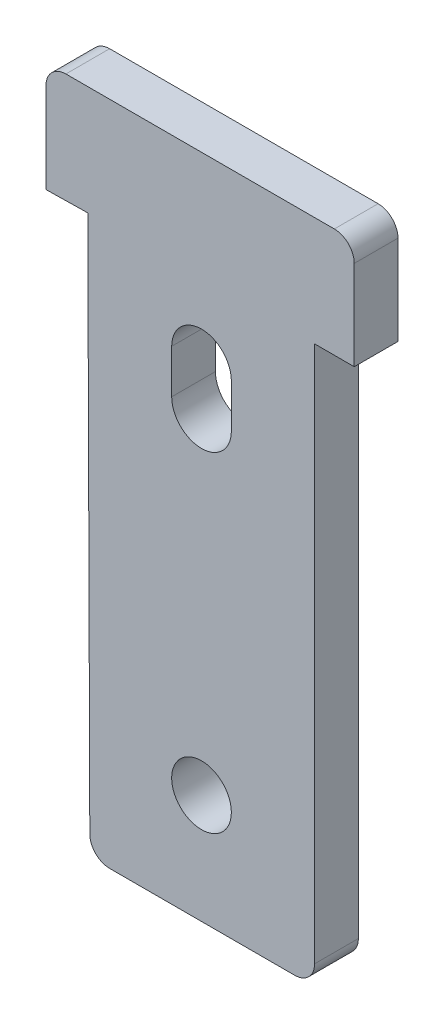
ISO-10303-21;
HEADER;
FILE_DESCRIPTION(('STEP AP214'),'2;1');
FILE_NAME('part.step','',(''),(''),'','','');
FILE_SCHEMA(('AUTOMOTIVE_DESIGN { 1 0 10303 214 1 1 1 1 }'));
ENDSEC;
DATA;
#1=APPLICATION_CONTEXT('core data for automotive mechanical design processes');
#2=APPLICATION_PROTOCOL_DEFINITION('international standard','automotive_design',2000,#1);
#3=PRODUCT_CONTEXT('',#1,'mechanical');
#4=PRODUCT('Part','Part','',(#3));
#5=PRODUCT_RELATED_PRODUCT_CATEGORY('part','',(#4));
#6=PRODUCT_DEFINITION_FORMATION('','',#4);
#7=PRODUCT_DEFINITION_CONTEXT('part definition',#1,'design');
#8=PRODUCT_DEFINITION('design','',#6,#7);
#9=PRODUCT_DEFINITION_SHAPE('','',#8);
#10=(LENGTH_UNIT() NAMED_UNIT(*) SI_UNIT(.MILLI.,.METRE.));
#11=(NAMED_UNIT(*) PLANE_ANGLE_UNIT() SI_UNIT($,.RADIAN.));
#12=(NAMED_UNIT(*) SI_UNIT($,.STERADIAN.) SOLID_ANGLE_UNIT());
#13=UNCERTAINTY_MEASURE_WITH_UNIT(LENGTH_MEASURE(1.E-05),#10,'distance_accuracy_value','');
#14=(GEOMETRIC_REPRESENTATION_CONTEXT(3) GLOBAL_UNCERTAINTY_ASSIGNED_CONTEXT((#13)) GLOBAL_UNIT_ASSIGNED_CONTEXT((#10,
#11,#12)) REPRESENTATION_CONTEXT('',''));
#15=CARTESIAN_POINT('',(0.,0.,0.));
#16=DIRECTION('',(0.,0.,1.));
#17=DIRECTION('',(1.,0.,0.));
#18=AXIS2_PLACEMENT_3D('',#15,#16,#17);
#19=CARTESIAN_POINT('',(6.75,15.75,2.2));
#20=DIRECTION('',(0.,0.,-1.));
#21=DIRECTION('',(-1.,0.,0.));
#22=AXIS2_PLACEMENT_3D('',#19,#20,#21);
#23=PLANE('',#22);
#24=CARTESIAN_POINT('',(0.0701530233928553,-11.25,2.2));
#25=DIRECTION('',(0.,0.,1.));
#26=DIRECTION('',(1.,0.,0.));
#27=AXIS2_PLACEMENT_3D('',#24,#25,#26);
#28=CIRCLE('',#27,1.5);
#29=CARTESIAN_POINT('',(1.57015302339286,-11.25,2.2));
#30=VERTEX_POINT('',#29);
#31=EDGE_CURVE('E183',#30,#30,#28,.T.);
#32=ORIENTED_EDGE('',*,*,#31,.F.);
#33=EDGE_LOOP('',(#32));
#34=FACE_BOUND('',#33,.T.);
#35=CARTESIAN_POINT('',(6.75,15.75,2.2));
#36=DIRECTION('',(0.,0.,1.));
#37=DIRECTION('',(-1.,0.,0.));
#38=AXIS2_PLACEMENT_3D('',#35,#36,#37);
#39=CIRCLE('',#38,1.);
#40=CARTESIAN_POINT('',(7.75,15.75,2.2));
#41=VERTEX_POINT('',#40);
#42=CARTESIAN_POINT('',(6.74999999999999,16.75,2.2));
#43=VERTEX_POINT('',#42);
#44=EDGE_CURVE('E189',#41,#43,#39,.T.);
#45=ORIENTED_EDGE('',*,*,#44,.T.);
#46=DIRECTION('',(-1.,0.,0.));
#47=VECTOR('',#46,1.);
#48=CARTESIAN_POINT('',(6.74999999999999,16.75,2.2));
#49=LINE('',#48,#47);
#50=CARTESIAN_POINT('',(-6.74999999999999,16.75,2.2));
#51=VERTEX_POINT('',#50);
#52=EDGE_CURVE('E192',#43,#51,#49,.T.);
#53=ORIENTED_EDGE('',*,*,#52,.T.);
#54=CARTESIAN_POINT('',(-6.75,15.75,2.2));
#55=DIRECTION('',(0.,0.,1.));
#56=DIRECTION('',(1.,0.,0.));
#57=AXIS2_PLACEMENT_3D('',#54,#55,#56);
#58=CIRCLE('',#57,1.);
#59=CARTESIAN_POINT('',(-7.75,15.75,2.2));
#60=VERTEX_POINT('',#59);
#61=EDGE_CURVE('E195',#51,#60,#58,.T.);
#62=ORIENTED_EDGE('',*,*,#61,.T.);
#63=DIRECTION('',(0.,-1.,0.));
#64=VECTOR('',#63,1.);
#65=CARTESIAN_POINT('',(-7.75,11.2136315321853,2.2));
#66=LINE('',#65,#64);
#67=CARTESIAN_POINT('',(-7.75,11.2136315321853,2.2));
#68=VERTEX_POINT('',#67);
#69=EDGE_CURVE('E197',#60,#68,#66,.T.);
#70=ORIENTED_EDGE('',*,*,#69,.T.);
#71=DIRECTION('',(0.999850071655209,0.0173157215002551,0.));
#72=VECTOR('',#71,1.);
#73=CARTESIAN_POINT('',(-7.75,11.2136315321853,2.2));
#74=LINE('',#73,#72);
#75=CARTESIAN_POINT('',(-5.65,11.25,2.2));
#76=VERTEX_POINT('',#75);
#77=EDGE_CURVE('E199',#68,#76,#74,.T.);
#78=ORIENTED_EDGE('',*,*,#77,.T.);
#79=DIRECTION('',(0.00379802536148523,-0.999992787475667,0.));
#80=VECTOR('',#79,1.);
#81=CARTESIAN_POINT('',(-5.65,11.25,2.2));
#82=LINE('',#81,#80);
#83=CARTESIAN_POINT('',(-5.54743815051342,-15.7537980253615,2.2));
#84=VERTEX_POINT('',#83);
#85=EDGE_CURVE('E201',#76,#84,#82,.T.);
#86=ORIENTED_EDGE('',*,*,#85,.T.);
#87=CARTESIAN_POINT('',(-4.54744536303776,-15.75,2.2));
#88=DIRECTION('',(0.,0.,1.));
#89=DIRECTION('',(-1.,0.,0.));
#90=AXIS2_PLACEMENT_3D('',#87,#88,#89);
#91=CIRCLE('',#90,1.);
#92=CARTESIAN_POINT('',(-4.54744536303775,-16.75,2.2));
#93=VERTEX_POINT('',#92);
#94=EDGE_CURVE('E203',#84,#93,#91,.T.);
#95=ORIENTED_EDGE('',*,*,#94,.T.);
#96=DIRECTION('',(1.,0.,0.));
#97=VECTOR('',#96,1.);
#98=CARTESIAN_POINT('',(-4.54744536303775,-16.75,2.2));
#99=LINE('',#98,#97);
#100=CARTESIAN_POINT('',(4.75634547714092,-16.75,2.2));
#101=VERTEX_POINT('',#100);
#102=EDGE_CURVE('E205',#93,#101,#99,.T.);
#103=ORIENTED_EDGE('',*,*,#102,.T.);
#104=CARTESIAN_POINT('',(4.75634547714092,-15.75,2.2));
#105=DIRECTION('',(0.,0.,1.));
#106=DIRECTION('',(-1.,0.,0.));
#107=AXIS2_PLACEMENT_3D('',#104,#105,#106);
#108=CIRCLE('',#107,1.);
#109=CARTESIAN_POINT('',(5.75634547714092,-15.75,2.2));
#110=VERTEX_POINT('',#109);
#111=EDGE_CURVE('E207',#101,#110,#108,.T.);
#112=ORIENTED_EDGE('',*,*,#111,.T.);
#113=DIRECTION('',(0.,1.,0.));
#114=VECTOR('',#113,1.);
#115=CARTESIAN_POINT('',(5.75634547714092,-15.75,2.2));
#116=LINE('',#115,#114);
#117=CARTESIAN_POINT('',(5.75634547714092,11.25,2.2));
#118=VERTEX_POINT('',#117);
#119=EDGE_CURVE('E209',#110,#118,#116,.T.);
#120=ORIENTED_EDGE('',*,*,#119,.T.);
#121=DIRECTION('',(1.,0.,0.));
#122=VECTOR('',#121,1.);
#123=CARTESIAN_POINT('',(5.75634547714092,11.25,2.2));
#124=LINE('',#123,#122);
#125=CARTESIAN_POINT('',(7.75,11.25,2.2));
#126=VERTEX_POINT('',#125);
#127=EDGE_CURVE('E211',#118,#126,#124,.T.);
#128=ORIENTED_EDGE('',*,*,#127,.T.);
#129=DIRECTION('',(0.,1.,0.));
#130=VECTOR('',#129,1.);
#131=CARTESIAN_POINT('',(7.75,11.25,2.2));
#132=LINE('',#131,#130);
#133=EDGE_CURVE('E213',#126,#41,#132,.T.);
#134=ORIENTED_EDGE('',*,*,#133,.T.);
#135=EDGE_LOOP('',(#45,#53,#62,#70,#78,#86,#95,#103,#112,#120,#128,#134));
#136=FACE_BOUND('',#135,.T.);
#137=CARTESIAN_POINT('',(0.070153023392857,5.35,2.2));
#138=DIRECTION('',(0.,0.,1.));
#139=DIRECTION('',(1.,0.,0.));
#140=AXIS2_PLACEMENT_3D('',#137,#138,#139);
#141=CIRCLE('',#140,1.5);
#142=CARTESIAN_POINT('',(-1.42984697660714,5.35,2.2));
#143=VERTEX_POINT('',#142);
#144=CARTESIAN_POINT('',(1.57015302339286,5.35,2.2));
#145=VERTEX_POINT('',#144);
#146=EDGE_CURVE('E147',#143,#145,#141,.T.);
#147=ORIENTED_EDGE('',*,*,#146,.F.);
#148=DIRECTION('',(0.,-1.,0.));
#149=VECTOR('',#148,1.);
#150=CARTESIAN_POINT('',(-1.42984697660714,5.35,2.2));
#151=LINE('',#150,#149);
#152=CARTESIAN_POINT('',(-1.42984697660714,7.55,2.2));
#153=VERTEX_POINT('',#152);
#154=EDGE_CURVE('E169',#153,#143,#151,.T.);
#155=ORIENTED_EDGE('',*,*,#154,.F.);
#156=CARTESIAN_POINT('',(0.070153023392857,7.55,2.2));
#157=DIRECTION('',(0.,0.,1.));
#158=DIRECTION('',(1.,0.,0.));
#159=AXIS2_PLACEMENT_3D('',#156,#157,#158);
#160=CIRCLE('',#159,1.5);
#161=CARTESIAN_POINT('',(1.57015302339286,7.55,2.2));
#162=VERTEX_POINT('',#161);
#163=EDGE_CURVE('E167',#162,#153,#160,.T.);
#164=ORIENTED_EDGE('',*,*,#163,.F.);
#165=DIRECTION('',(0.,1.,0.));
#166=VECTOR('',#165,1.);
#167=CARTESIAN_POINT('',(1.57015302339286,5.35,2.2));
#168=LINE('',#167,#166);
#169=EDGE_CURVE('E155',#145,#162,#168,.T.);
#170=ORIENTED_EDGE('',*,*,#169,.F.);
#171=EDGE_LOOP('',(#147,#155,#164,#170));
#172=FACE_BOUND('',#171,.T.);
#173=ADVANCED_FACE('F34',(#34,#136,#172),#23,.F.);
#174=CARTESIAN_POINT('',(6.75,15.75,0.));
#175=DIRECTION('',(0.,0.,-1.));
#176=DIRECTION('',(-1.,0.,0.));
#177=AXIS2_PLACEMENT_3D('',#174,#175,#176);
#178=PLANE('',#177);
#179=CARTESIAN_POINT('',(6.75,15.75,0.));
#180=DIRECTION('',(0.,0.,1.));
#181=DIRECTION('',(-1.,0.,0.));
#182=AXIS2_PLACEMENT_3D('',#179,#180,#181);
#183=CIRCLE('',#182,1.);
#184=CARTESIAN_POINT('',(7.75,15.75,0.));
#185=VERTEX_POINT('',#184);
#186=CARTESIAN_POINT('',(6.74999999999999,16.75,0.));
#187=VERTEX_POINT('',#186);
#188=EDGE_CURVE('E186',#185,#187,#183,.T.);
#189=ORIENTED_EDGE('',*,*,#188,.F.);
#190=DIRECTION('',(0.,1.,0.));
#191=VECTOR('',#190,1.);
#192=CARTESIAN_POINT('',(7.75,11.25,0.));
#193=LINE('',#192,#191);
#194=CARTESIAN_POINT('',(7.75,11.25,0.));
#195=VERTEX_POINT('',#194);
#196=EDGE_CURVE('E193',#195,#185,#193,.T.);
#197=ORIENTED_EDGE('',*,*,#196,.F.);
#198=DIRECTION('',(1.,0.,0.));
#199=VECTOR('',#198,1.);
#200=CARTESIAN_POINT('',(5.75634547714092,11.25,0.));
#201=LINE('',#200,#199);
#202=CARTESIAN_POINT('',(5.75634547714092,11.25,0.));
#203=VERTEX_POINT('',#202);
#204=EDGE_CURVE('E236',#203,#195,#201,.T.);
#205=ORIENTED_EDGE('',*,*,#204,.F.);
#206=DIRECTION('',(0.,1.,0.));
#207=VECTOR('',#206,1.);
#208=CARTESIAN_POINT('',(5.75634547714092,-15.75,0.));
#209=LINE('',#208,#207);
#210=CARTESIAN_POINT('',(5.75634547714092,-15.75,0.));
#211=VERTEX_POINT('',#210);
#212=EDGE_CURVE('E234',#211,#203,#209,.T.);
#213=ORIENTED_EDGE('',*,*,#212,.F.);
#214=CARTESIAN_POINT('',(4.75634547714092,-15.75,0.));
#215=DIRECTION('',(0.,0.,1.));
#216=DIRECTION('',(-1.,0.,0.));
#217=AXIS2_PLACEMENT_3D('',#214,#215,#216);
#218=CIRCLE('',#217,1.);
#219=CARTESIAN_POINT('',(4.75634547714092,-16.75,0.));
#220=VERTEX_POINT('',#219);
#221=EDGE_CURVE('E232',#220,#211,#218,.T.);
#222=ORIENTED_EDGE('',*,*,#221,.F.);
#223=DIRECTION('',(1.,0.,0.));
#224=VECTOR('',#223,1.);
#225=CARTESIAN_POINT('',(-4.54744536303775,-16.75,0.));
#226=LINE('',#225,#224);
#227=CARTESIAN_POINT('',(-4.54744536303775,-16.75,0.));
#228=VERTEX_POINT('',#227);
#229=EDGE_CURVE('E230',#228,#220,#226,.T.);
#230=ORIENTED_EDGE('',*,*,#229,.F.);
#231=CARTESIAN_POINT('',(-4.54744536303776,-15.75,0.));
#232=DIRECTION('',(0.,0.,1.));
#233=DIRECTION('',(-1.,0.,0.));
#234=AXIS2_PLACEMENT_3D('',#231,#232,#233);
#235=CIRCLE('',#234,1.);
#236=CARTESIAN_POINT('',(-5.54743815051342,-15.7537980253615,0.));
#237=VERTEX_POINT('',#236);
#238=EDGE_CURVE('E228',#237,#228,#235,.T.);
#239=ORIENTED_EDGE('',*,*,#238,.F.);
#240=DIRECTION('',(0.00379802536148523,-0.999992787475667,0.));
#241=VECTOR('',#240,1.);
#242=CARTESIAN_POINT('',(-5.65,11.25,0.));
#243=LINE('',#242,#241);
#244=CARTESIAN_POINT('',(-5.65,11.25,0.));
#245=VERTEX_POINT('',#244);
#246=EDGE_CURVE('E226',#245,#237,#243,.T.);
#247=ORIENTED_EDGE('',*,*,#246,.F.);
#248=DIRECTION('',(0.999850071655209,0.0173157215002551,0.));
#249=VECTOR('',#248,1.);
#250=CARTESIAN_POINT('',(-7.75,11.2136315321853,0.));
#251=LINE('',#250,#249);
#252=CARTESIAN_POINT('',(-7.75,11.2136315321853,0.));
#253=VERTEX_POINT('',#252);
#254=EDGE_CURVE('E224',#253,#245,#251,.T.);
#255=ORIENTED_EDGE('',*,*,#254,.F.);
#256=DIRECTION('',(0.,-1.,0.));
#257=VECTOR('',#256,1.);
#258=CARTESIAN_POINT('',(-7.75,11.2136315321853,0.));
#259=LINE('',#258,#257);
#260=CARTESIAN_POINT('',(-7.75,15.75,0.));
#261=VERTEX_POINT('',#260);
#262=EDGE_CURVE('E222',#261,#253,#259,.T.);
#263=ORIENTED_EDGE('',*,*,#262,.F.);
#264=CARTESIAN_POINT('',(-6.75,15.75,0.));
#265=DIRECTION('',(0.,0.,1.));
#266=DIRECTION('',(1.,0.,0.));
#267=AXIS2_PLACEMENT_3D('',#264,#265,#266);
#268=CIRCLE('',#267,1.);
#269=CARTESIAN_POINT('',(-6.74999999999999,16.75,0.));
#270=VERTEX_POINT('',#269);
#271=EDGE_CURVE('E220',#270,#261,#268,.T.);
#272=ORIENTED_EDGE('',*,*,#271,.F.);
#273=DIRECTION('',(-1.,0.,0.));
#274=VECTOR('',#273,1.);
#275=CARTESIAN_POINT('',(6.74999999999999,16.75,0.));
#276=LINE('',#275,#274);
#277=EDGE_CURVE('E218',#187,#270,#276,.T.);
#278=ORIENTED_EDGE('',*,*,#277,.F.);
#279=EDGE_LOOP('',(#189,#197,#205,#213,#222,#230,#239,#247,#255,#263,#272,#278));
#280=FACE_BOUND('',#279,.T.);
#281=CARTESIAN_POINT('',(0.0701530233928553,-11.25,0.));
#282=DIRECTION('',(0.,0.,1.));
#283=DIRECTION('',(1.,0.,0.));
#284=AXIS2_PLACEMENT_3D('',#281,#282,#283);
#285=CIRCLE('',#284,1.5);
#286=CARTESIAN_POINT('',(1.57015302339286,-11.25,0.));
#287=VERTEX_POINT('',#286);
#288=EDGE_CURVE('E163',#287,#287,#285,.T.);
#289=ORIENTED_EDGE('',*,*,#288,.T.);
#290=EDGE_LOOP('',(#289));
#291=FACE_BOUND('',#290,.T.);
#292=DIRECTION('',(0.,-1.,0.));
#293=VECTOR('',#292,1.);
#294=CARTESIAN_POINT('',(-1.42984697660714,5.35,0.));
#295=LINE('',#294,#293);
#296=CARTESIAN_POINT('',(-1.42984697660714,7.55,0.));
#297=VERTEX_POINT('',#296);
#298=CARTESIAN_POINT('',(-1.42984697660714,5.35,0.));
#299=VERTEX_POINT('',#298);
#300=EDGE_CURVE('E156',#297,#299,#295,.T.);
#301=ORIENTED_EDGE('',*,*,#300,.T.);
#302=CARTESIAN_POINT('',(0.070153023392857,5.35,0.));
#303=DIRECTION('',(0.,0.,1.));
#304=DIRECTION('',(1.,0.,0.));
#305=AXIS2_PLACEMENT_3D('',#302,#303,#304);
#306=CIRCLE('',#305,1.5);
#307=CARTESIAN_POINT('',(1.57015302339286,5.35,0.));
#308=VERTEX_POINT('',#307);
#309=EDGE_CURVE('E57',#299,#308,#306,.T.);
#310=ORIENTED_EDGE('',*,*,#309,.T.);
#311=DIRECTION('',(0.,1.,0.));
#312=VECTOR('',#311,1.);
#313=CARTESIAN_POINT('',(1.57015302339286,5.35,0.));
#314=LINE('',#313,#312);
#315=CARTESIAN_POINT('',(1.57015302339286,7.55,0.));
#316=VERTEX_POINT('',#315);
#317=EDGE_CURVE('E162',#308,#316,#314,.T.);
#318=ORIENTED_EDGE('',*,*,#317,.T.);
#319=CARTESIAN_POINT('',(0.070153023392857,7.55,0.));
#320=DIRECTION('',(0.,0.,1.));
#321=DIRECTION('',(1.,0.,0.));
#322=AXIS2_PLACEMENT_3D('',#319,#320,#321);
#323=CIRCLE('',#322,1.5);
#324=EDGE_CURVE('E175',#316,#297,#323,.T.);
#325=ORIENTED_EDGE('',*,*,#324,.T.);
#326=EDGE_LOOP('',(#301,#310,#318,#325));
#327=FACE_BOUND('',#326,.T.);
#328=ADVANCED_FACE('F278',(#280,#291,#327),#178,.T.);
#329=CARTESIAN_POINT('',(6.75,15.75,2.2));
#330=DIRECTION('',(0.,0.,-1.));
#331=DIRECTION('',(-1.,0.,0.));
#332=AXIS2_PLACEMENT_3D('',#329,#330,#331);
#333=CYLINDRICAL_SURFACE('',#332,1.);
#334=ORIENTED_EDGE('',*,*,#188,.T.);
#335=DIRECTION('',(0.,0.,-1.));
#336=VECTOR('',#335,1.);
#337=CARTESIAN_POINT('',(6.74999999999999,16.75,2.2));
#338=LINE('',#337,#336);
#339=EDGE_CURVE('E11',#43,#187,#338,.T.);
#340=ORIENTED_EDGE('',*,*,#339,.F.);
#341=ORIENTED_EDGE('',*,*,#44,.F.);
#342=DIRECTION('',(0.,0.,-1.));
#343=VECTOR('',#342,1.);
#344=CARTESIAN_POINT('',(7.75,15.75,2.2));
#345=LINE('',#344,#343);
#346=EDGE_CURVE('E215',#41,#185,#345,.T.);
#347=ORIENTED_EDGE('',*,*,#346,.T.);
#348=EDGE_LOOP('',(#334,#340,#341,#347));
#349=FACE_BOUND('',#348,.T.);
#350=ADVANCED_FACE('F36',(#349),#333,.T.);
#351=CARTESIAN_POINT('',(6.74999999999999,16.75,2.2));
#352=DIRECTION('',(0.,-1.,0.));
#353=DIRECTION('',(0.,0.,-1.));
#354=AXIS2_PLACEMENT_3D('',#351,#352,#353);
#355=PLANE('',#354);
#356=ORIENTED_EDGE('',*,*,#277,.T.);
#357=DIRECTION('',(0.,0.,-1.));
#358=VECTOR('',#357,1.);
#359=CARTESIAN_POINT('',(-6.74999999999999,16.75,2.2));
#360=LINE('',#359,#358);
#361=EDGE_CURVE('E42',#51,#270,#360,.T.);
#362=ORIENTED_EDGE('',*,*,#361,.F.);
#363=ORIENTED_EDGE('',*,*,#52,.F.);
#364=ORIENTED_EDGE('',*,*,#339,.T.);
#365=EDGE_LOOP('',(#356,#362,#363,#364));
#366=FACE_BOUND('',#365,.T.);
#367=ADVANCED_FACE('F295',(#366),#355,.F.);
#368=CARTESIAN_POINT('',(-6.75,15.75,2.2));
#369=DIRECTION('',(0.,0.,-1.));
#370=DIRECTION('',(-1.,0.,0.));
#371=AXIS2_PLACEMENT_3D('',#368,#369,#370);
#372=CYLINDRICAL_SURFACE('',#371,1.);
#373=ORIENTED_EDGE('',*,*,#271,.T.);
#374=DIRECTION('',(0.,0.,-1.));
#375=VECTOR('',#374,1.);
#376=CARTESIAN_POINT('',(-7.75,15.75,2.2));
#377=LINE('',#376,#375);
#378=EDGE_CURVE('E265',#60,#261,#377,.T.);
#379=ORIENTED_EDGE('',*,*,#378,.F.);
#380=ORIENTED_EDGE('',*,*,#61,.F.);
#381=ORIENTED_EDGE('',*,*,#361,.T.);
#382=EDGE_LOOP('',(#373,#379,#380,#381));
#383=FACE_BOUND('',#382,.T.);
#384=ADVANCED_FACE('F272',(#383),#372,.T.);
#385=CARTESIAN_POINT('',(-7.75,11.2136315321853,2.2));
#386=DIRECTION('',(1.,0.,0.));
#387=DIRECTION('',(0.,0.,-1.));
#388=AXIS2_PLACEMENT_3D('',#385,#386,#387);
#389=PLANE('',#388);
#390=ORIENTED_EDGE('',*,*,#262,.T.);
#391=DIRECTION('',(0.,0.,-1.));
#392=VECTOR('',#391,1.);
#393=CARTESIAN_POINT('',(-7.75,11.2136315321853,2.2));
#394=LINE('',#393,#392);
#395=EDGE_CURVE('E262',#68,#253,#394,.T.);
#396=ORIENTED_EDGE('',*,*,#395,.F.);
#397=ORIENTED_EDGE('',*,*,#69,.F.);
#398=ORIENTED_EDGE('',*,*,#378,.T.);
#399=EDGE_LOOP('',(#390,#396,#397,#398));
#400=FACE_BOUND('',#399,.T.);
#401=ADVANCED_FACE('F284',(#400),#389,.F.);
#402=CARTESIAN_POINT('',(-7.75,11.2136315321853,2.2));
#403=DIRECTION('',(-0.0173157215002551,0.999850071655209,0.));
#404=DIRECTION('',(-0.999850071655209,-0.0173157215002551,0.));
#405=AXIS2_PLACEMENT_3D('',#402,#403,#404);
#406=PLANE('',#405);
#407=ORIENTED_EDGE('',*,*,#254,.T.);
#408=DIRECTION('',(0.,0.,-1.));
#409=VECTOR('',#408,1.);
#410=CARTESIAN_POINT('',(-5.65,11.25,2.2));
#411=LINE('',#410,#409);
#412=EDGE_CURVE('E259',#76,#245,#411,.T.);
#413=ORIENTED_EDGE('',*,*,#412,.F.);
#414=ORIENTED_EDGE('',*,*,#77,.F.);
#415=ORIENTED_EDGE('',*,*,#395,.T.);
#416=EDGE_LOOP('',(#407,#413,#414,#415));
#417=FACE_BOUND('',#416,.T.);
#418=ADVANCED_FACE('F288',(#417),#406,.F.);
#419=CARTESIAN_POINT('',(-5.65,11.25,2.2));
#420=DIRECTION('',(0.999992787475666,0.00379802536148523,0.));
#421=DIRECTION('',(-0.00379802536148523,0.999992787475667,0.));
#422=AXIS2_PLACEMENT_3D('',#419,#420,#421);
#423=PLANE('',#422);
#424=ORIENTED_EDGE('',*,*,#246,.T.);
#425=DIRECTION('',(0.,0.,-1.));
#426=VECTOR('',#425,1.);
#427=CARTESIAN_POINT('',(-5.54743815051342,-15.7537980253615,2.2));
#428=LINE('',#427,#426);
#429=EDGE_CURVE('E256',#84,#237,#428,.T.);
#430=ORIENTED_EDGE('',*,*,#429,.F.);
#431=ORIENTED_EDGE('',*,*,#85,.F.);
#432=ORIENTED_EDGE('',*,*,#412,.T.);
#433=EDGE_LOOP('',(#424,#430,#431,#432));
#434=FACE_BOUND('',#433,.T.);
#435=ADVANCED_FACE('F328',(#434),#423,.F.);
#436=CARTESIAN_POINT('',(-4.54744536303776,-15.75,2.2));
#437=DIRECTION('',(0.,0.,-1.));
#438=DIRECTION('',(-1.,0.,0.));
#439=AXIS2_PLACEMENT_3D('',#436,#437,#438);
#440=CYLINDRICAL_SURFACE('',#439,1.);
#441=ORIENTED_EDGE('',*,*,#238,.T.);
#442=DIRECTION('',(0.,0.,-1.));
#443=VECTOR('',#442,1.);
#444=CARTESIAN_POINT('',(-4.54744536303775,-16.75,2.2));
#445=LINE('',#444,#443);
#446=EDGE_CURVE('E253',#93,#228,#445,.T.);
#447=ORIENTED_EDGE('',*,*,#446,.F.);
#448=ORIENTED_EDGE('',*,*,#94,.F.);
#449=ORIENTED_EDGE('',*,*,#429,.T.);
#450=EDGE_LOOP('',(#441,#447,#448,#449));
#451=FACE_BOUND('',#450,.T.);
#452=ADVANCED_FACE('F326',(#451),#440,.T.);
#453=CARTESIAN_POINT('',(-4.54744536303775,-16.75,2.2));
#454=DIRECTION('',(0.,1.,0.));
#455=DIRECTION('',(0.,0.,1.));
#456=AXIS2_PLACEMENT_3D('',#453,#454,#455);
#457=PLANE('',#456);
#458=ORIENTED_EDGE('',*,*,#229,.T.);
#459=DIRECTION('',(0.,0.,-1.));
#460=VECTOR('',#459,1.);
#461=CARTESIAN_POINT('',(4.75634547714092,-16.75,2.2));
#462=LINE('',#461,#460);
#463=EDGE_CURVE('E250',#101,#220,#462,.T.);
#464=ORIENTED_EDGE('',*,*,#463,.F.);
#465=ORIENTED_EDGE('',*,*,#102,.F.);
#466=ORIENTED_EDGE('',*,*,#446,.T.);
#467=EDGE_LOOP('',(#458,#464,#465,#466));
#468=FACE_BOUND('',#467,.T.);
#469=ADVANCED_FACE('F322',(#468),#457,.F.);
#470=CARTESIAN_POINT('',(4.75634547714092,-15.75,2.2));
#471=DIRECTION('',(0.,0.,-1.));
#472=DIRECTION('',(-1.,0.,0.));
#473=AXIS2_PLACEMENT_3D('',#470,#471,#472);
#474=CYLINDRICAL_SURFACE('',#473,1.);
#475=ORIENTED_EDGE('',*,*,#221,.T.);
#476=DIRECTION('',(0.,0.,-1.));
#477=VECTOR('',#476,1.);
#478=CARTESIAN_POINT('',(5.75634547714092,-15.75,2.2));
#479=LINE('',#478,#477);
#480=EDGE_CURVE('E247',#110,#211,#479,.T.);
#481=ORIENTED_EDGE('',*,*,#480,.F.);
#482=ORIENTED_EDGE('',*,*,#111,.F.);
#483=ORIENTED_EDGE('',*,*,#463,.T.);
#484=EDGE_LOOP('',(#475,#481,#482,#483));
#485=FACE_BOUND('',#484,.T.);
#486=ADVANCED_FACE('F317',(#485),#474,.T.);
#487=CARTESIAN_POINT('',(5.75634547714092,-15.75,2.2));
#488=DIRECTION('',(-1.,0.,0.));
#489=DIRECTION('',(0.,0.,1.));
#490=AXIS2_PLACEMENT_3D('',#487,#488,#489);
#491=PLANE('',#490);
#492=ORIENTED_EDGE('',*,*,#212,.T.);
#493=DIRECTION('',(0.,0.,-1.));
#494=VECTOR('',#493,1.);
#495=CARTESIAN_POINT('',(5.75634547714092,11.25,2.2));
#496=LINE('',#495,#494);
#497=EDGE_CURVE('E244',#118,#203,#496,.T.);
#498=ORIENTED_EDGE('',*,*,#497,.F.);
#499=ORIENTED_EDGE('',*,*,#119,.F.);
#500=ORIENTED_EDGE('',*,*,#480,.T.);
#501=EDGE_LOOP('',(#492,#498,#499,#500));
#502=FACE_BOUND('',#501,.T.);
#503=ADVANCED_FACE('F311',(#502),#491,.F.);
#504=CARTESIAN_POINT('',(5.75634547714092,11.25,2.2));
#505=DIRECTION('',(0.,1.,0.));
#506=DIRECTION('',(0.,0.,1.));
#507=AXIS2_PLACEMENT_3D('',#504,#505,#506);
#508=PLANE('',#507);
#509=ORIENTED_EDGE('',*,*,#204,.T.);
#510=DIRECTION('',(0.,0.,-1.));
#511=VECTOR('',#510,1.);
#512=CARTESIAN_POINT('',(7.75,11.25,2.2));
#513=LINE('',#512,#511);
#514=EDGE_CURVE('E241',#126,#195,#513,.T.);
#515=ORIENTED_EDGE('',*,*,#514,.F.);
#516=ORIENTED_EDGE('',*,*,#127,.F.);
#517=ORIENTED_EDGE('',*,*,#497,.T.);
#518=EDGE_LOOP('',(#509,#515,#516,#517));
#519=FACE_BOUND('',#518,.T.);
#520=ADVANCED_FACE('F307',(#519),#508,.F.);
#521=CARTESIAN_POINT('',(7.75,11.25,2.2));
#522=DIRECTION('',(-1.,0.,0.));
#523=DIRECTION('',(0.,-1.,0.));
#524=AXIS2_PLACEMENT_3D('',#521,#522,#523);
#525=PLANE('',#524);
#526=ORIENTED_EDGE('',*,*,#196,.T.);
#527=ORIENTED_EDGE('',*,*,#346,.F.);
#528=ORIENTED_EDGE('',*,*,#133,.F.);
#529=ORIENTED_EDGE('',*,*,#514,.T.);
#530=EDGE_LOOP('',(#526,#527,#528,#529));
#531=FACE_BOUND('',#530,.T.);
#532=ADVANCED_FACE('F302',(#531),#525,.F.);
#533=CARTESIAN_POINT('',(0.0701530233928553,-11.25,2.2));
#534=DIRECTION('',(0.,0.,-1.));
#535=DIRECTION('',(-1.,0.,0.));
#536=AXIS2_PLACEMENT_3D('',#533,#534,#535);
#537=CYLINDRICAL_SURFACE('',#536,1.5);
#538=ORIENTED_EDGE('',*,*,#31,.T.);
#539=EDGE_LOOP('',(#538));
#540=FACE_BOUND('',#539,.T.);
#541=ORIENTED_EDGE('',*,*,#288,.F.);
#542=EDGE_LOOP('',(#541));
#543=FACE_BOUND('',#542,.T.);
#544=ADVANCED_FACE('F346',(#540,#543),#537,.F.);
#545=CARTESIAN_POINT('',(0.070153023392857,5.35,2.2));
#546=DIRECTION('',(0.,0.,-1.));
#547=DIRECTION('',(-1.,0.,0.));
#548=AXIS2_PLACEMENT_3D('',#545,#546,#547);
#549=CYLINDRICAL_SURFACE('',#548,1.5);
#550=ORIENTED_EDGE('',*,*,#309,.F.);
#551=DIRECTION('',(0.,0.,-1.));
#552=VECTOR('',#551,1.);
#553=CARTESIAN_POINT('',(-1.42984697660714,5.35,2.2));
#554=LINE('',#553,#552);
#555=EDGE_CURVE('E151',#143,#299,#554,.T.);
#556=ORIENTED_EDGE('',*,*,#555,.F.);
#557=ORIENTED_EDGE('',*,*,#146,.T.);
#558=DIRECTION('',(0.,0.,-1.));
#559=VECTOR('',#558,1.);
#560=CARTESIAN_POINT('',(1.57015302339286,5.35,2.2));
#561=LINE('',#560,#559);
#562=EDGE_CURVE('E150',#145,#308,#561,.T.);
#563=ORIENTED_EDGE('',*,*,#562,.T.);
#564=EDGE_LOOP('',(#550,#556,#557,#563));
#565=FACE_BOUND('',#564,.T.);
#566=ADVANCED_FACE('F149',(#565),#549,.F.);
#567=CARTESIAN_POINT('',(1.57015302339286,5.35,2.2));
#568=DIRECTION('',(-1.,0.,0.));
#569=DIRECTION('',(0.,0.,1.));
#570=AXIS2_PLACEMENT_3D('',#567,#568,#569);
#571=PLANE('',#570);
#572=ORIENTED_EDGE('',*,*,#317,.F.);
#573=ORIENTED_EDGE('',*,*,#562,.F.);
#574=ORIENTED_EDGE('',*,*,#169,.T.);
#575=DIRECTION('',(0.,0.,-1.));
#576=VECTOR('',#575,1.);
#577=CARTESIAN_POINT('',(1.57015302339286,7.55,2.2));
#578=LINE('',#577,#576);
#579=EDGE_CURVE('E164',#162,#316,#578,.T.);
#580=ORIENTED_EDGE('',*,*,#579,.T.);
#581=EDGE_LOOP('',(#572,#573,#574,#580));
#582=FACE_BOUND('',#581,.T.);
#583=ADVANCED_FACE('F159',(#582),#571,.T.);
#584=CARTESIAN_POINT('',(0.070153023392857,7.55,2.2));
#585=DIRECTION('',(0.,0.,-1.));
#586=DIRECTION('',(-1.,0.,0.));
#587=AXIS2_PLACEMENT_3D('',#584,#585,#586);
#588=CYLINDRICAL_SURFACE('',#587,1.5);
#589=ORIENTED_EDGE('',*,*,#324,.F.);
#590=ORIENTED_EDGE('',*,*,#579,.F.);
#591=ORIENTED_EDGE('',*,*,#163,.T.);
#592=DIRECTION('',(0.,0.,-1.));
#593=VECTOR('',#592,1.);
#594=CARTESIAN_POINT('',(-1.42984697660714,7.55,2.2));
#595=LINE('',#594,#593);
#596=EDGE_CURVE('E49',#153,#297,#595,.T.);
#597=ORIENTED_EDGE('',*,*,#596,.T.);
#598=EDGE_LOOP('',(#589,#590,#591,#597));
#599=FACE_BOUND('',#598,.T.);
#600=ADVANCED_FACE('F395',(#599),#588,.F.);
#601=CARTESIAN_POINT('',(-1.42984697660714,5.35,2.2));
#602=DIRECTION('',(1.,0.,0.));
#603=DIRECTION('',(0.,0.,-1.));
#604=AXIS2_PLACEMENT_3D('',#601,#602,#603);
#605=PLANE('',#604);
#606=ORIENTED_EDGE('',*,*,#300,.F.);
#607=ORIENTED_EDGE('',*,*,#596,.F.);
#608=ORIENTED_EDGE('',*,*,#154,.T.);
#609=ORIENTED_EDGE('',*,*,#555,.T.);
#610=EDGE_LOOP('',(#606,#607,#608,#609));
#611=FACE_BOUND('',#610,.T.);
#612=ADVANCED_FACE('F402',(#611),#605,.T.);
#613=CLOSED_SHELL('',(#173,#328,#350,#367,#384,#401,#418,#435,#452,#469,#486,#503,#520,#532,
#544,#566,#583,#600,#612));
#614=MANIFOLD_SOLID_BREP('B2',#613);
#615=ADVANCED_BREP_SHAPE_REPRESENTATION('',(#18,#614),#14);
#616=SHAPE_DEFINITION_REPRESENTATION(#9,#615);
ENDSEC;
END-ISO-10303-21;
